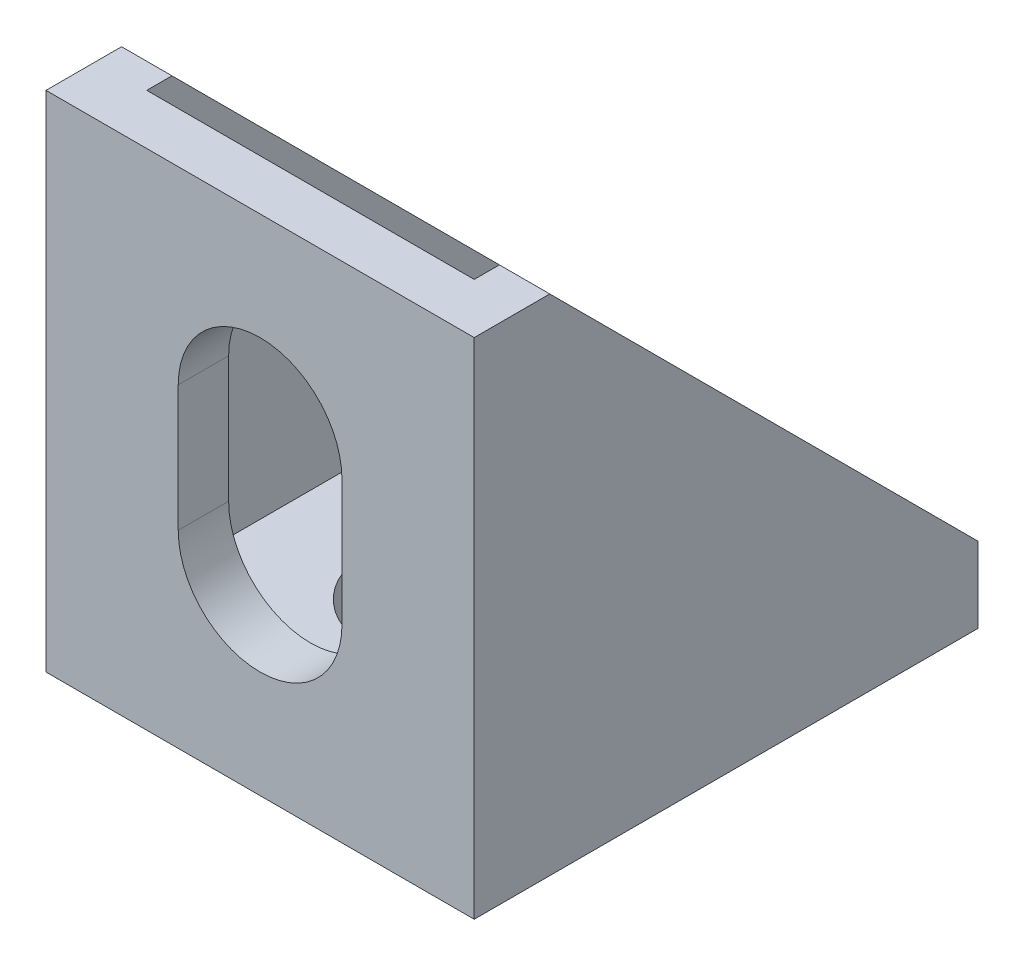
ISO-10303-21;
HEADER;
FILE_DESCRIPTION(('STEP AP214'),'2;1');
FILE_NAME('part.step','',(''),(''),'','','');
FILE_SCHEMA(('AUTOMOTIVE_DESIGN { 1 0 10303 214 1 1 1 1 }'));
ENDSEC;
DATA;
#1=APPLICATION_CONTEXT('core data for automotive mechanical design processes');
#2=APPLICATION_PROTOCOL_DEFINITION('international standard','automotive_design',2000,#1);
#3=PRODUCT_CONTEXT('',#1,'mechanical');
#4=PRODUCT('Part','Part','',(#3));
#5=PRODUCT_RELATED_PRODUCT_CATEGORY('part','',(#4));
#6=PRODUCT_DEFINITION_FORMATION('','',#4);
#7=PRODUCT_DEFINITION_CONTEXT('part definition',#1,'design');
#8=PRODUCT_DEFINITION('design','',#6,#7);
#9=PRODUCT_DEFINITION_SHAPE('','',#8);
#10=(LENGTH_UNIT() NAMED_UNIT(*) SI_UNIT(.MILLI.,.METRE.));
#11=(NAMED_UNIT(*) PLANE_ANGLE_UNIT() SI_UNIT($,.RADIAN.));
#12=(NAMED_UNIT(*) SI_UNIT($,.STERADIAN.) SOLID_ANGLE_UNIT());
#13=UNCERTAINTY_MEASURE_WITH_UNIT(LENGTH_MEASURE(1.E-05),#10,'distance_accuracy_value','');
#14=(GEOMETRIC_REPRESENTATION_CONTEXT(3) GLOBAL_UNCERTAINTY_ASSIGNED_CONTEXT((#13)) GLOBAL_UNIT_ASSIGNED_CONTEXT((#10,
#11,#12)) REPRESENTATION_CONTEXT('',''));
#15=CARTESIAN_POINT('',(0.,0.,0.));
#16=DIRECTION('',(0.,0.,1.));
#17=DIRECTION('',(1.,0.,0.));
#18=AXIS2_PLACEMENT_3D('',#15,#16,#17);
#19=CARTESIAN_POINT('',(8.5,3.,-20.));
#20=DIRECTION('',(0.,-0.707106781186548,0.707106781186548));
#21=DIRECTION('',(0.,-0.707106781186548,-0.707106781186548));
#22=AXIS2_PLACEMENT_3D('',#19,#20,#21);
#23=PLANE('',#22);
#24=DIRECTION('',(-1.,0.,0.));
#25=VECTOR('',#24,1.);
#26=CARTESIAN_POINT('',(8.5,3.,-20.));
#27=LINE('',#26,#25);
#28=CARTESIAN_POINT('',(8.5,3.,-20.));
#29=VERTEX_POINT('',#28);
#30=CARTESIAN_POINT('',(6.5,3.,-20.));
#31=VERTEX_POINT('',#30);
#32=EDGE_CURVE('E273',#29,#31,#27,.T.);
#33=ORIENTED_EDGE('',*,*,#32,.T.);
#34=DIRECTION('',(0.,0.707106781186548,0.707106781186548));
#35=VECTOR('',#34,1.);
#36=CARTESIAN_POINT('',(6.5,3.,-20.));
#37=LINE('',#36,#35);
#38=CARTESIAN_POINT('',(6.5,20.,-3.));
#39=VERTEX_POINT('',#38);
#40=EDGE_CURVE('E246',#31,#39,#37,.T.);
#41=ORIENTED_EDGE('',*,*,#40,.T.);
#42=DIRECTION('',(-1.,0.,0.));
#43=VECTOR('',#42,1.);
#44=CARTESIAN_POINT('',(8.5,20.,-3.));
#45=LINE('',#44,#43);
#46=CARTESIAN_POINT('',(8.5,20.,-3.));
#47=VERTEX_POINT('',#46);
#48=EDGE_CURVE('E12',#47,#39,#45,.T.);
#49=ORIENTED_EDGE('',*,*,#48,.F.);
#50=DIRECTION('',(0.,0.707106781186547,0.707106781186547));
#51=VECTOR('',#50,1.);
#52=CARTESIAN_POINT('',(8.5,3.,-20.));
#53=LINE('',#52,#51);
#54=EDGE_CURVE('E250',#29,#47,#53,.T.);
#55=ORIENTED_EDGE('',*,*,#54,.F.);
#56=EDGE_LOOP('',(#33,#41,#49,#55));
#57=FACE_BOUND('',#56,.T.);
#58=ADVANCED_FACE('F34',(#57),#23,.F.);
#59=CARTESIAN_POINT('',(-6.5,20.,-3.));
#60=VERTEX_POINT('',#59);
#61=CARTESIAN_POINT('',(-8.5,20.,-3.));
#62=VERTEX_POINT('',#61);
#63=EDGE_CURVE('E42',#60,#62,#45,.T.);
#64=ORIENTED_EDGE('',*,*,#63,.F.);
#65=DIRECTION('',(0.,-0.707106781186548,-0.707106781186548));
#66=VECTOR('',#65,1.);
#67=CARTESIAN_POINT('',(-6.5,3.,-20.));
#68=LINE('',#67,#66);
#69=CARTESIAN_POINT('',(-6.5,3.,-20.));
#70=VERTEX_POINT('',#69);
#71=EDGE_CURVE('E243',#60,#70,#68,.T.);
#72=ORIENTED_EDGE('',*,*,#71,.T.);
#73=CARTESIAN_POINT('',(-8.5,3.,-20.));
#74=VERTEX_POINT('',#73);
#75=EDGE_CURVE('E262',#70,#74,#27,.T.);
#76=ORIENTED_EDGE('',*,*,#75,.T.);
#77=DIRECTION('',(0.,0.707106781186547,0.707106781186547));
#78=VECTOR('',#77,1.);
#79=CARTESIAN_POINT('',(-8.5,3.,-20.));
#80=LINE('',#79,#78);
#81=EDGE_CURVE('E249',#74,#62,#80,.T.);
#82=ORIENTED_EDGE('',*,*,#81,.T.);
#83=EDGE_LOOP('',(#64,#72,#76,#82));
#84=FACE_BOUND('',#83,.T.);
#85=ADVANCED_FACE('F36',(#84),#23,.F.);
#86=CARTESIAN_POINT('',(8.5,20.,-3.));
#87=DIRECTION('',(0.,-1.,0.));
#88=DIRECTION('',(0.,0.,-1.));
#89=AXIS2_PLACEMENT_3D('',#86,#87,#88);
#90=PLANE('',#89);
#91=ORIENTED_EDGE('',*,*,#48,.T.);
#92=DIRECTION('',(0.,0.,-1.));
#93=VECTOR('',#92,1.);
#94=CARTESIAN_POINT('',(6.5,20.,21.4009345590327));
#95=LINE('',#94,#93);
#96=CARTESIAN_POINT('',(6.5,20.,-2.));
#97=VERTEX_POINT('',#96);
#98=EDGE_CURVE('E226',#97,#39,#95,.T.);
#99=ORIENTED_EDGE('',*,*,#98,.F.);
#100=DIRECTION('',(-1.,0.,0.));
#101=VECTOR('',#100,1.);
#102=CARTESIAN_POINT('',(6.5,20.,-2.));
#103=LINE('',#102,#101);
#104=CARTESIAN_POINT('',(-6.5,20.,-2.));
#105=VERTEX_POINT('',#104);
#106=EDGE_CURVE('E225',#97,#105,#103,.T.);
#107=ORIENTED_EDGE('',*,*,#106,.T.);
#108=DIRECTION('',(0.,0.,-1.));
#109=VECTOR('',#108,1.);
#110=CARTESIAN_POINT('',(-6.5,20.,21.4009345590327));
#111=LINE('',#110,#109);
#112=EDGE_CURVE('E236',#105,#60,#111,.T.);
#113=ORIENTED_EDGE('',*,*,#112,.T.);
#114=ORIENTED_EDGE('',*,*,#63,.T.);
#115=DIRECTION('',(0.,0.,1.));
#116=VECTOR('',#115,1.);
#117=CARTESIAN_POINT('',(-8.5,20.,-3.));
#118=LINE('',#117,#116);
#119=CARTESIAN_POINT('',(-8.5,20.,0.));
#120=VERTEX_POINT('',#119);
#121=EDGE_CURVE('E265',#62,#120,#118,.T.);
#122=ORIENTED_EDGE('',*,*,#121,.T.);
#123=DIRECTION('',(-1.,0.,0.));
#124=VECTOR('',#123,1.);
#125=CARTESIAN_POINT('',(8.5,20.,0.));
#126=LINE('',#125,#124);
#127=CARTESIAN_POINT('',(8.5,20.,0.));
#128=VERTEX_POINT('',#127);
#129=EDGE_CURVE('E281',#128,#120,#126,.T.);
#130=ORIENTED_EDGE('',*,*,#129,.F.);
#131=DIRECTION('',(0.,0.,1.));
#132=VECTOR('',#131,1.);
#133=CARTESIAN_POINT('',(8.5,20.,-3.));
#134=LINE('',#133,#132);
#135=EDGE_CURVE('E253',#47,#128,#134,.T.);
#136=ORIENTED_EDGE('',*,*,#135,.F.);
#137=EDGE_LOOP('',(#91,#99,#107,#113,#114,#122,#130,#136));
#138=FACE_BOUND('',#137,.T.);
#139=ADVANCED_FACE('F290',(#138),#90,.F.);
#140=CARTESIAN_POINT('',(8.5,20.,0.));
#141=DIRECTION('',(0.,0.,-1.));
#142=DIRECTION('',(0.,1.,0.));
#143=AXIS2_PLACEMENT_3D('',#140,#141,#142);
#144=PLANE('',#143);
#145=DIRECTION('',(0.,-1.,0.));
#146=VECTOR('',#145,1.);
#147=CARTESIAN_POINT('',(3.25,7.5,0.));
#148=LINE('',#147,#146);
#149=CARTESIAN_POINT('',(3.25,12.5,0.));
#150=VERTEX_POINT('',#149);
#151=CARTESIAN_POINT('',(3.25,7.5,0.));
#152=VERTEX_POINT('',#151);
#153=EDGE_CURVE('E201',#150,#152,#148,.T.);
#154=ORIENTED_EDGE('',*,*,#153,.T.);
#155=CARTESIAN_POINT('',(0.,7.5,0.));
#156=DIRECTION('',(0.,0.,-1.));
#157=DIRECTION('',(0.,1.,0.));
#158=AXIS2_PLACEMENT_3D('',#155,#156,#157);
#159=CIRCLE('',#158,3.25);
#160=CARTESIAN_POINT('',(-3.25,7.5,0.));
#161=VERTEX_POINT('',#160);
#162=EDGE_CURVE('E191',#152,#161,#159,.T.);
#163=ORIENTED_EDGE('',*,*,#162,.T.);
#164=DIRECTION('',(0.,1.,0.));
#165=VECTOR('',#164,1.);
#166=CARTESIAN_POINT('',(-3.25,7.5,0.));
#167=LINE('',#166,#165);
#168=CARTESIAN_POINT('',(-3.25,12.5,0.));
#169=VERTEX_POINT('',#168);
#170=EDGE_CURVE('E194',#161,#169,#167,.T.);
#171=ORIENTED_EDGE('',*,*,#170,.T.);
#172=CARTESIAN_POINT('',(0.,12.5,0.));
#173=DIRECTION('',(0.,0.,-1.));
#174=DIRECTION('',(0.,1.,0.));
#175=AXIS2_PLACEMENT_3D('',#172,#173,#174);
#176=CIRCLE('',#175,3.25);
#177=EDGE_CURVE('E198',#169,#150,#176,.T.);
#178=ORIENTED_EDGE('',*,*,#177,.T.);
#179=EDGE_LOOP('',(#154,#163,#171,#178));
#180=FACE_BOUND('',#179,.T.);
#181=DIRECTION('',(0.,-1.,0.));
#182=VECTOR('',#181,1.);
#183=CARTESIAN_POINT('',(-8.5,20.,0.));
#184=LINE('',#183,#182);
#185=CARTESIAN_POINT('',(-8.5,0.,0.));
#186=VERTEX_POINT('',#185);
#187=EDGE_CURVE('E267',#120,#186,#184,.T.);
#188=ORIENTED_EDGE('',*,*,#187,.T.);
#189=DIRECTION('',(-1.,0.,0.));
#190=VECTOR('',#189,1.);
#191=CARTESIAN_POINT('',(8.5,0.,0.));
#192=LINE('',#191,#190);
#193=CARTESIAN_POINT('',(8.5,0.,0.));
#194=VERTEX_POINT('',#193);
#195=EDGE_CURVE('E279',#194,#186,#192,.T.);
#196=ORIENTED_EDGE('',*,*,#195,.F.);
#197=DIRECTION('',(0.,-1.,0.));
#198=VECTOR('',#197,1.);
#199=CARTESIAN_POINT('',(8.5,20.,0.));
#200=LINE('',#199,#198);
#201=EDGE_CURVE('E256',#128,#194,#200,.T.);
#202=ORIENTED_EDGE('',*,*,#201,.F.);
#203=ORIENTED_EDGE('',*,*,#129,.T.);
#204=EDGE_LOOP('',(#188,#196,#202,#203));
#205=FACE_BOUND('',#204,.T.);
#206=ADVANCED_FACE('F308',(#180,#205),#144,.F.);
#207=CARTESIAN_POINT('',(8.5,0.,0.));
#208=DIRECTION('',(0.,1.,0.));
#209=DIRECTION('',(0.,0.,1.));
#210=AXIS2_PLACEMENT_3D('',#207,#208,#209);
#211=PLANE('',#210);
#212=DIRECTION('',(0.,0.,1.));
#213=VECTOR('',#212,1.);
#214=CARTESIAN_POINT('',(-3.25,0.,0.));
#215=LINE('',#214,#213);
#216=CARTESIAN_POINT('',(-3.25,0.,-12.5));
#217=VERTEX_POINT('',#216);
#218=CARTESIAN_POINT('',(-3.25,0.,-7.5));
#219=VERTEX_POINT('',#218);
#220=EDGE_CURVE('E184',#217,#219,#215,.T.);
#221=ORIENTED_EDGE('',*,*,#220,.T.);
#222=CARTESIAN_POINT('',(0.,0.,-7.5));
#223=DIRECTION('',(0.,1.,0.));
#224=DIRECTION('',(0.,0.,1.));
#225=AXIS2_PLACEMENT_3D('',#222,#223,#224);
#226=CIRCLE('',#225,3.25);
#227=CARTESIAN_POINT('',(3.25,0.,-7.5));
#228=VERTEX_POINT('',#227);
#229=EDGE_CURVE('E187',#219,#228,#226,.T.);
#230=ORIENTED_EDGE('',*,*,#229,.T.);
#231=DIRECTION('',(0.,0.,-1.));
#232=VECTOR('',#231,1.);
#233=CARTESIAN_POINT('',(3.25,0.,0.));
#234=LINE('',#233,#232);
#235=CARTESIAN_POINT('',(3.25,0.,-12.5));
#236=VERTEX_POINT('',#235);
#237=EDGE_CURVE('E179',#228,#236,#234,.T.);
#238=ORIENTED_EDGE('',*,*,#237,.T.);
#239=CARTESIAN_POINT('',(0.,0.,-12.5));
#240=DIRECTION('',(0.,1.,0.));
#241=DIRECTION('',(0.,0.,1.));
#242=AXIS2_PLACEMENT_3D('',#239,#240,#241);
#243=CIRCLE('',#242,3.25);
#244=EDGE_CURVE('E159',#236,#217,#243,.T.);
#245=ORIENTED_EDGE('',*,*,#244,.T.);
#246=EDGE_LOOP('',(#221,#230,#238,#245));
#247=FACE_BOUND('',#246,.T.);
#248=DIRECTION('',(0.,0.,-1.));
#249=VECTOR('',#248,1.);
#250=CARTESIAN_POINT('',(-8.5,0.,0.));
#251=LINE('',#250,#249);
#252=CARTESIAN_POINT('',(-8.5,0.,-20.));
#253=VERTEX_POINT('',#252);
#254=EDGE_CURVE('E269',#186,#253,#251,.T.);
#255=ORIENTED_EDGE('',*,*,#254,.T.);
#256=DIRECTION('',(-1.,0.,0.));
#257=VECTOR('',#256,1.);
#258=CARTESIAN_POINT('',(8.5,0.,-20.));
#259=LINE('',#258,#257);
#260=CARTESIAN_POINT('',(8.5,0.,-20.));
#261=VERTEX_POINT('',#260);
#262=EDGE_CURVE('E276',#261,#253,#259,.T.);
#263=ORIENTED_EDGE('',*,*,#262,.F.);
#264=DIRECTION('',(0.,0.,-1.));
#265=VECTOR('',#264,1.);
#266=CARTESIAN_POINT('',(8.5,0.,0.));
#267=LINE('',#266,#265);
#268=EDGE_CURVE('E258',#194,#261,#267,.T.);
#269=ORIENTED_EDGE('',*,*,#268,.F.);
#270=ORIENTED_EDGE('',*,*,#195,.T.);
#271=EDGE_LOOP('',(#255,#263,#269,#270));
#272=FACE_BOUND('',#271,.T.);
#273=ADVANCED_FACE('F305',(#247,#272),#211,.F.);
#274=CARTESIAN_POINT('',(8.5,0.,-20.));
#275=DIRECTION('',(0.,0.,1.));
#276=DIRECTION('',(1.,0.,0.));
#277=AXIS2_PLACEMENT_3D('',#274,#275,#276);
#278=PLANE('',#277);
#279=DIRECTION('',(0.,1.,0.));
#280=VECTOR('',#279,1.);
#281=CARTESIAN_POINT('',(-8.5,0.,-20.));
#282=LINE('',#281,#280);
#283=EDGE_CURVE('E254',#253,#74,#282,.T.);
#284=ORIENTED_EDGE('',*,*,#283,.T.);
#285=ORIENTED_EDGE('',*,*,#75,.F.);
#286=DIRECTION('',(-1.,0.,0.));
#287=VECTOR('',#286,1.);
#288=CARTESIAN_POINT('',(6.5,3.,-20.));
#289=LINE('',#288,#287);
#290=EDGE_CURVE('E216',#31,#70,#289,.T.);
#291=ORIENTED_EDGE('',*,*,#290,.F.);
#292=ORIENTED_EDGE('',*,*,#32,.F.);
#293=DIRECTION('',(0.,1.,0.));
#294=VECTOR('',#293,1.);
#295=CARTESIAN_POINT('',(8.5,0.,-20.));
#296=LINE('',#295,#294);
#297=EDGE_CURVE('E260',#261,#29,#296,.T.);
#298=ORIENTED_EDGE('',*,*,#297,.F.);
#299=ORIENTED_EDGE('',*,*,#262,.T.);
#300=EDGE_LOOP('',(#284,#285,#291,#292,#298,#299));
#301=FACE_BOUND('',#300,.T.);
#302=ADVANCED_FACE('F301',(#301),#278,.F.);
#303=CARTESIAN_POINT('',(8.5,0.,0.));
#304=DIRECTION('',(1.,0.,0.));
#305=DIRECTION('',(0.,0.,-1.));
#306=AXIS2_PLACEMENT_3D('',#303,#304,#305);
#307=PLANE('',#306);
#308=ORIENTED_EDGE('',*,*,#54,.T.);
#309=ORIENTED_EDGE('',*,*,#135,.T.);
#310=ORIENTED_EDGE('',*,*,#201,.T.);
#311=ORIENTED_EDGE('',*,*,#268,.T.);
#312=ORIENTED_EDGE('',*,*,#297,.T.);
#313=EDGE_LOOP('',(#308,#309,#310,#311,#312));
#314=FACE_BOUND('',#313,.T.);
#315=ADVANCED_FACE('F310',(#314),#307,.T.);
#316=CARTESIAN_POINT('',(-8.5,0.,0.));
#317=DIRECTION('',(1.,0.,0.));
#318=DIRECTION('',(0.,0.,-1.));
#319=AXIS2_PLACEMENT_3D('',#316,#317,#318);
#320=PLANE('',#319);
#321=ORIENTED_EDGE('',*,*,#81,.F.);
#322=ORIENTED_EDGE('',*,*,#283,.F.);
#323=ORIENTED_EDGE('',*,*,#254,.F.);
#324=ORIENTED_EDGE('',*,*,#187,.F.);
#325=ORIENTED_EDGE('',*,*,#121,.F.);
#326=EDGE_LOOP('',(#321,#322,#323,#324,#325));
#327=FACE_BOUND('',#326,.T.);
#328=ADVANCED_FACE('F295',(#327),#320,.F.);
#329=CARTESIAN_POINT('',(6.5,3.,21.4009345590327));
#330=DIRECTION('',(1.,0.,0.));
#331=DIRECTION('',(0.,0.,-1.));
#332=AXIS2_PLACEMENT_3D('',#329,#330,#331);
#333=PLANE('',#332);
#334=DIRECTION('',(0.,0.,-1.));
#335=VECTOR('',#334,1.);
#336=CARTESIAN_POINT('',(6.5,3.,21.4009345590327));
#337=LINE('',#336,#335);
#338=CARTESIAN_POINT('',(6.5,3.,-2.));
#339=VERTEX_POINT('',#338);
#340=EDGE_CURVE('E234',#339,#31,#337,.T.);
#341=ORIENTED_EDGE('',*,*,#340,.F.);
#342=DIRECTION('',(0.,1.,0.));
#343=VECTOR('',#342,1.);
#344=CARTESIAN_POINT('',(6.5,3.,-2.));
#345=LINE('',#344,#343);
#346=EDGE_CURVE('E229',#339,#97,#345,.T.);
#347=ORIENTED_EDGE('',*,*,#346,.T.);
#348=ORIENTED_EDGE('',*,*,#98,.T.);
#349=ORIENTED_EDGE('',*,*,#40,.F.);
#350=EDGE_LOOP('',(#341,#347,#348,#349));
#351=FACE_BOUND('',#350,.T.);
#352=ADVANCED_FACE('F319',(#351),#333,.F.);
#353=CARTESIAN_POINT('',(-6.5,3.,21.4009345590327));
#354=DIRECTION('',(-1.,0.,0.));
#355=DIRECTION('',(0.,0.,1.));
#356=AXIS2_PLACEMENT_3D('',#353,#354,#355);
#357=PLANE('',#356);
#358=ORIENTED_EDGE('',*,*,#112,.F.);
#359=DIRECTION('',(0.,-1.,0.));
#360=VECTOR('',#359,1.);
#361=CARTESIAN_POINT('',(-6.5,3.,-2.));
#362=LINE('',#361,#360);
#363=CARTESIAN_POINT('',(-6.5,3.,-2.));
#364=VERTEX_POINT('',#363);
#365=EDGE_CURVE('E223',#105,#364,#362,.T.);
#366=ORIENTED_EDGE('',*,*,#365,.T.);
#367=DIRECTION('',(0.,0.,-1.));
#368=VECTOR('',#367,1.);
#369=CARTESIAN_POINT('',(-6.5,3.,21.4009345590327));
#370=LINE('',#369,#368);
#371=EDGE_CURVE('E239',#364,#70,#370,.T.);
#372=ORIENTED_EDGE('',*,*,#371,.T.);
#373=ORIENTED_EDGE('',*,*,#71,.F.);
#374=EDGE_LOOP('',(#358,#366,#372,#373));
#375=FACE_BOUND('',#374,.T.);
#376=ADVANCED_FACE('F327',(#375),#357,.F.);
#377=CARTESIAN_POINT('',(6.5,3.,21.4009345590327));
#378=DIRECTION('',(0.,-1.,0.));
#379=DIRECTION('',(0.,0.,-1.));
#380=AXIS2_PLACEMENT_3D('',#377,#378,#379);
#381=PLANE('',#380);
#382=DIRECTION('',(0.,0.,-1.));
#383=VECTOR('',#382,1.);
#384=CARTESIAN_POINT('',(3.25,3.,-7.5));
#385=LINE('',#384,#383);
#386=CARTESIAN_POINT('',(3.25,3.,-7.5));
#387=VERTEX_POINT('',#386);
#388=CARTESIAN_POINT('',(3.25,3.,-12.5));
#389=VERTEX_POINT('',#388);
#390=EDGE_CURVE('E165',#387,#389,#385,.T.);
#391=ORIENTED_EDGE('',*,*,#390,.F.);
#392=CARTESIAN_POINT('',(0.,3.,-7.5));
#393=DIRECTION('',(0.,1.,0.));
#394=DIRECTION('',(0.,0.,1.));
#395=AXIS2_PLACEMENT_3D('',#392,#393,#394);
#396=CIRCLE('',#395,3.25);
#397=CARTESIAN_POINT('',(-3.25,3.,-7.5));
#398=VERTEX_POINT('',#397);
#399=EDGE_CURVE('E57',#398,#387,#396,.T.);
#400=ORIENTED_EDGE('',*,*,#399,.F.);
#401=DIRECTION('',(0.,0.,1.));
#402=VECTOR('',#401,1.);
#403=CARTESIAN_POINT('',(-3.25,3.,-7.5));
#404=LINE('',#403,#402);
#405=CARTESIAN_POINT('',(-3.25,3.,-12.5));
#406=VERTEX_POINT('',#405);
#407=EDGE_CURVE('E172',#406,#398,#404,.T.);
#408=ORIENTED_EDGE('',*,*,#407,.F.);
#409=CARTESIAN_POINT('',(0.,3.,-12.5));
#410=DIRECTION('',(0.,1.,0.));
#411=DIRECTION('',(0.,0.,1.));
#412=AXIS2_PLACEMENT_3D('',#409,#410,#411);
#413=CIRCLE('',#412,3.25);
#414=EDGE_CURVE('E156',#389,#406,#413,.T.);
#415=ORIENTED_EDGE('',*,*,#414,.F.);
#416=EDGE_LOOP('',(#391,#400,#408,#415));
#417=FACE_BOUND('',#416,.T.);
#418=DIRECTION('',(1.,0.,0.));
#419=VECTOR('',#418,1.);
#420=CARTESIAN_POINT('',(6.5,3.,-2.));
#421=LINE('',#420,#419);
#422=EDGE_CURVE('E231',#364,#339,#421,.T.);
#423=ORIENTED_EDGE('',*,*,#422,.T.);
#424=ORIENTED_EDGE('',*,*,#340,.T.);
#425=ORIENTED_EDGE('',*,*,#290,.T.);
#426=ORIENTED_EDGE('',*,*,#371,.F.);
#427=EDGE_LOOP('',(#423,#424,#425,#426));
#428=FACE_BOUND('',#427,.T.);
#429=ADVANCED_FACE('F169',(#417,#428),#381,.F.);
#430=CARTESIAN_POINT('',(8.5,20.,-2.));
#431=DIRECTION('',(0.,0.,-1.));
#432=DIRECTION('',(0.,1.,0.));
#433=AXIS2_PLACEMENT_3D('',#430,#431,#432);
#434=PLANE('',#433);
#435=CARTESIAN_POINT('',(0.,7.5,-2.));
#436=DIRECTION('',(0.,0.,-1.));
#437=DIRECTION('',(0.,1.,0.));
#438=AXIS2_PLACEMENT_3D('',#435,#436,#437);
#439=CIRCLE('',#438,3.25);
#440=CARTESIAN_POINT('',(3.25,7.5,-2.));
#441=VERTEX_POINT('',#440);
#442=CARTESIAN_POINT('',(-3.25,7.5,-2.));
#443=VERTEX_POINT('',#442);
#444=EDGE_CURVE('E190',#441,#443,#439,.T.);
#445=ORIENTED_EDGE('',*,*,#444,.F.);
#446=DIRECTION('',(0.,-1.,0.));
#447=VECTOR('',#446,1.);
#448=CARTESIAN_POINT('',(3.25,7.5,-2.));
#449=LINE('',#448,#447);
#450=CARTESIAN_POINT('',(3.25,12.5,-2.));
#451=VERTEX_POINT('',#450);
#452=EDGE_CURVE('E195',#451,#441,#449,.T.);
#453=ORIENTED_EDGE('',*,*,#452,.F.);
#454=CARTESIAN_POINT('',(0.,12.5,-2.));
#455=DIRECTION('',(0.,0.,-1.));
#456=DIRECTION('',(0.,1.,0.));
#457=AXIS2_PLACEMENT_3D('',#454,#455,#456);
#458=CIRCLE('',#457,3.25);
#459=CARTESIAN_POINT('',(-3.25,12.5,-2.));
#460=VERTEX_POINT('',#459);
#461=EDGE_CURVE('E209',#460,#451,#458,.T.);
#462=ORIENTED_EDGE('',*,*,#461,.F.);
#463=DIRECTION('',(0.,1.,0.));
#464=VECTOR('',#463,1.);
#465=CARTESIAN_POINT('',(-3.25,7.5,-2.));
#466=LINE('',#465,#464);
#467=EDGE_CURVE('E206',#443,#460,#466,.T.);
#468=ORIENTED_EDGE('',*,*,#467,.F.);
#469=EDGE_LOOP('',(#445,#453,#462,#468));
#470=FACE_BOUND('',#469,.T.);
#471=ORIENTED_EDGE('',*,*,#346,.F.);
#472=ORIENTED_EDGE('',*,*,#422,.F.);
#473=ORIENTED_EDGE('',*,*,#365,.F.);
#474=ORIENTED_EDGE('',*,*,#106,.F.);
#475=EDGE_LOOP('',(#471,#472,#473,#474));
#476=FACE_BOUND('',#475,.T.);
#477=ADVANCED_FACE('F325',(#470,#476),#434,.T.);
#478=CARTESIAN_POINT('',(0.,7.5,0.));
#479=DIRECTION('',(0.,0.,-1.));
#480=DIRECTION('',(0.,1.,0.));
#481=AXIS2_PLACEMENT_3D('',#478,#479,#480);
#482=CYLINDRICAL_SURFACE('',#481,3.25);
#483=ORIENTED_EDGE('',*,*,#444,.T.);
#484=DIRECTION('',(0.,0.,-1.));
#485=VECTOR('',#484,1.);
#486=CARTESIAN_POINT('',(-3.25,7.5,0.));
#487=LINE('',#486,#485);
#488=EDGE_CURVE('E204',#161,#443,#487,.T.);
#489=ORIENTED_EDGE('',*,*,#488,.F.);
#490=ORIENTED_EDGE('',*,*,#162,.F.);
#491=DIRECTION('',(0.,0.,-1.));
#492=VECTOR('',#491,1.);
#493=CARTESIAN_POINT('',(3.25,7.5,0.));
#494=LINE('',#493,#492);
#495=EDGE_CURVE('E214',#152,#441,#494,.T.);
#496=ORIENTED_EDGE('',*,*,#495,.T.);
#497=EDGE_LOOP('',(#483,#489,#490,#496));
#498=FACE_BOUND('',#497,.T.);
#499=ADVANCED_FACE('F395',(#498),#482,.F.);
#500=CARTESIAN_POINT('',(3.25,7.5,0.));
#501=DIRECTION('',(1.,0.,0.));
#502=DIRECTION('',(0.,1.,0.));
#503=AXIS2_PLACEMENT_3D('',#500,#501,#502);
#504=PLANE('',#503);
#505=ORIENTED_EDGE('',*,*,#452,.T.);
#506=ORIENTED_EDGE('',*,*,#495,.F.);
#507=ORIENTED_EDGE('',*,*,#153,.F.);
#508=DIRECTION('',(0.,0.,-1.));
#509=VECTOR('',#508,1.);
#510=CARTESIAN_POINT('',(3.25,12.5,0.));
#511=LINE('',#510,#509);
#512=EDGE_CURVE('E217',#150,#451,#511,.T.);
#513=ORIENTED_EDGE('',*,*,#512,.T.);
#514=EDGE_LOOP('',(#505,#506,#507,#513));
#515=FACE_BOUND('',#514,.T.);
#516=ADVANCED_FACE('F404',(#515),#504,.F.);
#517=CARTESIAN_POINT('',(0.,12.5,0.));
#518=DIRECTION('',(0.,0.,-1.));
#519=DIRECTION('',(0.,1.,0.));
#520=AXIS2_PLACEMENT_3D('',#517,#518,#519);
#521=CYLINDRICAL_SURFACE('',#520,3.25);
#522=ORIENTED_EDGE('',*,*,#461,.T.);
#523=ORIENTED_EDGE('',*,*,#512,.F.);
#524=ORIENTED_EDGE('',*,*,#177,.F.);
#525=DIRECTION('',(0.,0.,-1.));
#526=VECTOR('',#525,1.);
#527=CARTESIAN_POINT('',(-3.25,12.5,0.));
#528=LINE('',#527,#526);
#529=EDGE_CURVE('E219',#169,#460,#528,.T.);
#530=ORIENTED_EDGE('',*,*,#529,.T.);
#531=EDGE_LOOP('',(#522,#523,#524,#530));
#532=FACE_BOUND('',#531,.T.);
#533=ADVANCED_FACE('F414',(#532),#521,.F.);
#534=CARTESIAN_POINT('',(-3.25,7.5,0.));
#535=DIRECTION('',(-1.,0.,0.));
#536=DIRECTION('',(0.,-1.,0.));
#537=AXIS2_PLACEMENT_3D('',#534,#535,#536);
#538=PLANE('',#537);
#539=ORIENTED_EDGE('',*,*,#467,.T.);
#540=ORIENTED_EDGE('',*,*,#529,.F.);
#541=ORIENTED_EDGE('',*,*,#170,.F.);
#542=ORIENTED_EDGE('',*,*,#488,.T.);
#543=EDGE_LOOP('',(#539,#540,#541,#542));
#544=FACE_BOUND('',#543,.T.);
#545=ADVANCED_FACE('F424',(#544),#538,.F.);
#546=CARTESIAN_POINT('',(0.,-14.,-7.5));
#547=DIRECTION('',(0.,1.,0.));
#548=DIRECTION('',(0.,0.,1.));
#549=AXIS2_PLACEMENT_3D('',#546,#547,#548);
#550=CYLINDRICAL_SURFACE('',#549,3.25);
#551=DIRECTION('',(0.,1.,0.));
#552=VECTOR('',#551,1.);
#553=CARTESIAN_POINT('',(-3.25,-14.,-7.5));
#554=LINE('',#553,#552);
#555=EDGE_CURVE('E177',#219,#398,#554,.T.);
#556=ORIENTED_EDGE('',*,*,#555,.T.);
#557=ORIENTED_EDGE('',*,*,#399,.T.);
#558=DIRECTION('',(0.,1.,0.));
#559=VECTOR('',#558,1.);
#560=CARTESIAN_POINT('',(3.25,-14.,-7.5));
#561=LINE('',#560,#559);
#562=EDGE_CURVE('E162',#228,#387,#561,.T.);
#563=ORIENTED_EDGE('',*,*,#562,.F.);
#564=ORIENTED_EDGE('',*,*,#229,.F.);
#565=EDGE_LOOP('',(#556,#557,#563,#564));
#566=FACE_BOUND('',#565,.T.);
#567=ADVANCED_FACE('F434',(#566),#550,.F.);
#568=CARTESIAN_POINT('',(-3.25,-14.,-7.5));
#569=DIRECTION('',(-1.,0.,0.));
#570=DIRECTION('',(0.,0.,1.));
#571=AXIS2_PLACEMENT_3D('',#568,#569,#570);
#572=PLANE('',#571);
#573=DIRECTION('',(0.,1.,0.));
#574=VECTOR('',#573,1.);
#575=CARTESIAN_POINT('',(-3.25,-14.,-12.5));
#576=LINE('',#575,#574);
#577=EDGE_CURVE('E161',#217,#406,#576,.T.);
#578=ORIENTED_EDGE('',*,*,#577,.T.);
#579=ORIENTED_EDGE('',*,*,#407,.T.);
#580=ORIENTED_EDGE('',*,*,#555,.F.);
#581=ORIENTED_EDGE('',*,*,#220,.F.);
#582=EDGE_LOOP('',(#578,#579,#580,#581));
#583=FACE_BOUND('',#582,.T.);
#584=ADVANCED_FACE('F454',(#583),#572,.F.);
#585=CARTESIAN_POINT('',(0.,-14.,-12.5));
#586=DIRECTION('',(0.,1.,0.));
#587=DIRECTION('',(0.,0.,1.));
#588=AXIS2_PLACEMENT_3D('',#585,#586,#587);
#589=CYLINDRICAL_SURFACE('',#588,3.25);
#590=DIRECTION('',(0.,1.,0.));
#591=VECTOR('',#590,1.);
#592=CARTESIAN_POINT('',(3.25,-14.,-12.5));
#593=LINE('',#592,#591);
#594=EDGE_CURVE('E49',#236,#389,#593,.T.);
#595=ORIENTED_EDGE('',*,*,#594,.T.);
#596=ORIENTED_EDGE('',*,*,#414,.T.);
#597=ORIENTED_EDGE('',*,*,#577,.F.);
#598=ORIENTED_EDGE('',*,*,#244,.F.);
#599=EDGE_LOOP('',(#595,#596,#597,#598));
#600=FACE_BOUND('',#599,.T.);
#601=ADVANCED_FACE('F153',(#600),#589,.F.);
#602=CARTESIAN_POINT('',(3.25,-14.,-7.5));
#603=DIRECTION('',(1.,0.,0.));
#604=DIRECTION('',(0.,0.,-1.));
#605=AXIS2_PLACEMENT_3D('',#602,#603,#604);
#606=PLANE('',#605);
#607=ORIENTED_EDGE('',*,*,#562,.T.);
#608=ORIENTED_EDGE('',*,*,#390,.T.);
#609=ORIENTED_EDGE('',*,*,#594,.F.);
#610=ORIENTED_EDGE('',*,*,#237,.F.);
#611=EDGE_LOOP('',(#607,#608,#609,#610));
#612=FACE_BOUND('',#611,.T.);
#613=ADVANCED_FACE('F166',(#612),#606,.F.);
#614=CLOSED_SHELL('',(#58,#85,#139,#206,#273,#302,#315,#328,#352,#376,#429,#477,#499,#516,#533,
#545,#567,#584,#601,#613));
#615=MANIFOLD_SOLID_BREP('B2',#614);
#616=ADVANCED_BREP_SHAPE_REPRESENTATION('',(#18,#615),#14);
#617=SHAPE_DEFINITION_REPRESENTATION(#9,#616);
ENDSEC;
END-ISO-10303-21;
